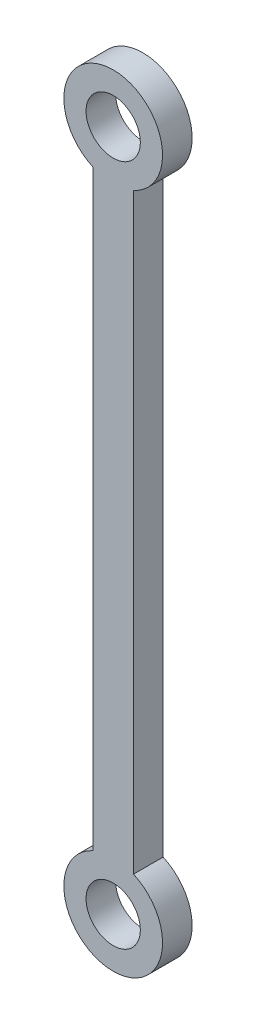
ISO-10303-21;
HEADER;
FILE_DESCRIPTION(('STEP AP214'),'2;1');
FILE_NAME('part.step','',(''),(''),'','','');
FILE_SCHEMA(('AUTOMOTIVE_DESIGN { 1 0 10303 214 1 1 1 1 }'));
ENDSEC;
DATA;
#1=APPLICATION_CONTEXT('core data for automotive mechanical design processes');
#2=APPLICATION_PROTOCOL_DEFINITION('international standard','automotive_design',2000,#1);
#3=PRODUCT_CONTEXT('',#1,'mechanical');
#4=PRODUCT('Part','Part','',(#3));
#5=PRODUCT_RELATED_PRODUCT_CATEGORY('part','',(#4));
#6=PRODUCT_DEFINITION_FORMATION('','',#4);
#7=PRODUCT_DEFINITION_CONTEXT('part definition',#1,'design');
#8=PRODUCT_DEFINITION('design','',#6,#7);
#9=PRODUCT_DEFINITION_SHAPE('','',#8);
#10=(LENGTH_UNIT() NAMED_UNIT(*) SI_UNIT(.MILLI.,.METRE.));
#11=(NAMED_UNIT(*) PLANE_ANGLE_UNIT() SI_UNIT($,.RADIAN.));
#12=(NAMED_UNIT(*) SI_UNIT($,.STERADIAN.) SOLID_ANGLE_UNIT());
#13=UNCERTAINTY_MEASURE_WITH_UNIT(LENGTH_MEASURE(1.E-05),#10,'distance_accuracy_value','');
#14=(GEOMETRIC_REPRESENTATION_CONTEXT(3) GLOBAL_UNCERTAINTY_ASSIGNED_CONTEXT((#13)) GLOBAL_UNIT_ASSIGNED_CONTEXT((#10,
#11,#12)) REPRESENTATION_CONTEXT('',''));
#15=CARTESIAN_POINT('',(0.,0.,0.));
#16=DIRECTION('',(0.,0.,1.));
#17=DIRECTION('',(1.,0.,0.));
#18=AXIS2_PLACEMENT_3D('',#15,#16,#17);
#19=CARTESIAN_POINT('',(642.687607750701,-1296.13673865925,1.5));
#20=DIRECTION('',(0.,0.,1.));
#21=DIRECTION('',(1.,0.,0.));
#22=AXIS2_PLACEMENT_3D('',#19,#20,#21);
#23=PLANE('',#22);
#24=CARTESIAN_POINT('',(642.687607750701,-1296.13673865925,1.5));
#25=DIRECTION('',(0.,0.,1.));
#26=DIRECTION('',(1.,0.,0.));
#27=AXIS2_PLACEMENT_3D('',#24,#25,#26);
#28=CIRCLE('',#27,2.75000000000002);
#29=CARTESIAN_POINT('',(645.437607750701,-1296.13673865925,1.5));
#30=VERTEX_POINT('',#29);
#31=EDGE_CURVE('E107',#30,#30,#28,.T.);
#32=ORIENTED_EDGE('',*,*,#31,.F.);
#33=EDGE_LOOP('',(#32));
#34=FACE_BOUND('',#33,.T.);
#35=CARTESIAN_POINT('',(642.687607750701,-1296.13673865925,1.5));
#36=DIRECTION('',(0.,0.,1.));
#37=DIRECTION('',(1.,0.,0.));
#38=AXIS2_PLACEMENT_3D('',#35,#36,#37);
#39=CIRCLE('',#38,5.00000000000005);
#40=CARTESIAN_POINT('',(640.625334238876,-1291.58184810486,1.5));
#41=VERTEX_POINT('',#40);
#42=CARTESIAN_POINT('',(644.749881262525,-1291.58184810486,1.5));
#43=VERTEX_POINT('',#42);
#44=EDGE_CURVE('E92',#41,#43,#39,.T.);
#45=ORIENTED_EDGE('',*,*,#44,.T.);
#46=DIRECTION('',(0.,1.,0.));
#47=VECTOR('',#46,1.);
#48=CARTESIAN_POINT('',(644.749881262525,-1231.58184810486,1.5));
#49=LINE('',#48,#47);
#50=CARTESIAN_POINT('',(644.749881262525,-1231.58184810486,1.5));
#51=VERTEX_POINT('',#50);
#52=EDGE_CURVE('E87',#43,#51,#49,.T.);
#53=ORIENTED_EDGE('',*,*,#52,.T.);
#54=CARTESIAN_POINT('',(642.687607750701,-1227.02695755047,1.5));
#55=DIRECTION('',(0.,0.,1.));
#56=DIRECTION('',(1.,0.,0.));
#57=AXIS2_PLACEMENT_3D('',#54,#55,#56);
#58=CIRCLE('',#57,5.00000000000018);
#59=CARTESIAN_POINT('',(640.625334238876,-1231.58184810486,1.5));
#60=VERTEX_POINT('',#59);
#61=EDGE_CURVE('E90',#51,#60,#58,.T.);
#62=ORIENTED_EDGE('',*,*,#61,.T.);
#63=DIRECTION('',(0.,-1.,0.));
#64=VECTOR('',#63,1.);
#65=CARTESIAN_POINT('',(640.625334238876,-1231.58184810486,1.5));
#66=LINE('',#65,#64);
#67=EDGE_CURVE('E57',#60,#41,#66,.T.);
#68=ORIENTED_EDGE('',*,*,#67,.T.);
#69=EDGE_LOOP('',(#45,#53,#62,#68));
#70=FACE_BOUND('',#69,.T.);
#71=CARTESIAN_POINT('',(642.687607750701,-1227.02695755047,1.5));
#72=DIRECTION('',(0.,0.,1.));
#73=DIRECTION('',(1.,0.,0.));
#74=AXIS2_PLACEMENT_3D('',#71,#72,#73);
#75=CIRCLE('',#74,2.75000000000002);
#76=CARTESIAN_POINT('',(645.437607750701,-1227.02695755047,1.5));
#77=VERTEX_POINT('',#76);
#78=EDGE_CURVE('E122',#77,#77,#75,.T.);
#79=ORIENTED_EDGE('',*,*,#78,.F.);
#80=EDGE_LOOP('',(#79));
#81=FACE_BOUND('',#80,.T.);
#82=ADVANCED_FACE('F40',(#34,#70,#81),#23,.T.);
#83=CARTESIAN_POINT('',(642.687607750701,-1296.13673865925,-1.5));
#84=DIRECTION('',(0.,0.,1.));
#85=DIRECTION('',(1.,0.,0.));
#86=AXIS2_PLACEMENT_3D('',#83,#84,#85);
#87=PLANE('',#86);
#88=CARTESIAN_POINT('',(642.687607750701,-1296.13673865925,-1.5));
#89=DIRECTION('',(0.,0.,1.));
#90=DIRECTION('',(1.,0.,0.));
#91=AXIS2_PLACEMENT_3D('',#88,#89,#90);
#92=CIRCLE('',#91,5.00000000000005);
#93=CARTESIAN_POINT('',(640.625334238876,-1291.58184810486,-1.5));
#94=VERTEX_POINT('',#93);
#95=CARTESIAN_POINT('',(644.749881262525,-1291.58184810486,-1.5));
#96=VERTEX_POINT('',#95);
#97=EDGE_CURVE('E104',#94,#96,#92,.T.);
#98=ORIENTED_EDGE('',*,*,#97,.F.);
#99=DIRECTION('',(0.,-1.,0.));
#100=VECTOR('',#99,1.);
#101=CARTESIAN_POINT('',(640.625334238876,-1231.58184810486,-1.5));
#102=LINE('',#101,#100);
#103=CARTESIAN_POINT('',(640.625334238876,-1231.58184810486,-1.5));
#104=VERTEX_POINT('',#103);
#105=EDGE_CURVE('E80',#104,#94,#102,.T.);
#106=ORIENTED_EDGE('',*,*,#105,.F.);
#107=CARTESIAN_POINT('',(642.687607750701,-1227.02695755047,-1.5));
#108=DIRECTION('',(0.,0.,1.));
#109=DIRECTION('',(1.,0.,0.));
#110=AXIS2_PLACEMENT_3D('',#107,#108,#109);
#111=CIRCLE('',#110,5.00000000000018);
#112=CARTESIAN_POINT('',(644.749881262525,-1231.58184810486,-1.5));
#113=VERTEX_POINT('',#112);
#114=EDGE_CURVE('E74',#113,#104,#111,.T.);
#115=ORIENTED_EDGE('',*,*,#114,.F.);
#116=DIRECTION('',(0.,1.,0.));
#117=VECTOR('',#116,1.);
#118=CARTESIAN_POINT('',(644.749881262525,-1231.58184810486,-1.5));
#119=LINE('',#118,#117);
#120=EDGE_CURVE('E96',#96,#113,#119,.T.);
#121=ORIENTED_EDGE('',*,*,#120,.F.);
#122=EDGE_LOOP('',(#98,#106,#115,#121));
#123=FACE_BOUND('',#122,.T.);
#124=CARTESIAN_POINT('',(642.687607750701,-1296.13673865925,-1.5));
#125=DIRECTION('',(0.,0.,1.));
#126=DIRECTION('',(1.,0.,0.));
#127=AXIS2_PLACEMENT_3D('',#124,#125,#126);
#128=CIRCLE('',#127,2.75000000000002);
#129=CARTESIAN_POINT('',(645.437607750701,-1296.13673865925,-1.5));
#130=VERTEX_POINT('',#129);
#131=EDGE_CURVE('E119',#130,#130,#128,.T.);
#132=ORIENTED_EDGE('',*,*,#131,.T.);
#133=EDGE_LOOP('',(#132));
#134=FACE_BOUND('',#133,.T.);
#135=CARTESIAN_POINT('',(642.687607750701,-1227.02695755047,-1.5));
#136=DIRECTION('',(0.,0.,1.));
#137=DIRECTION('',(1.,0.,0.));
#138=AXIS2_PLACEMENT_3D('',#135,#136,#137);
#139=CIRCLE('',#138,2.75000000000002);
#140=CARTESIAN_POINT('',(645.437607750701,-1227.02695755047,-1.5));
#141=VERTEX_POINT('',#140);
#142=EDGE_CURVE('E125',#141,#141,#139,.T.);
#143=ORIENTED_EDGE('',*,*,#142,.T.);
#144=EDGE_LOOP('',(#143));
#145=FACE_BOUND('',#144,.T.);
#146=ADVANCED_FACE('F115',(#123,#134,#145),#87,.F.);
#147=CARTESIAN_POINT('',(642.687607750701,-1296.13673865925,1.5));
#148=DIRECTION('',(0.,0.,-1.));
#149=DIRECTION('',(-1.,0.,0.));
#150=AXIS2_PLACEMENT_3D('',#147,#148,#149);
#151=CYLINDRICAL_SURFACE('',#150,5.00000000000005);
#152=ORIENTED_EDGE('',*,*,#97,.T.);
#153=DIRECTION('',(0.,0.,-1.));
#154=VECTOR('',#153,1.);
#155=CARTESIAN_POINT('',(644.749881262525,-1291.58184810486,1.5));
#156=LINE('',#155,#154);
#157=EDGE_CURVE('E11',#43,#96,#156,.T.);
#158=ORIENTED_EDGE('',*,*,#157,.F.);
#159=ORIENTED_EDGE('',*,*,#44,.F.);
#160=DIRECTION('',(0.,0.,-1.));
#161=VECTOR('',#160,1.);
#162=CARTESIAN_POINT('',(640.625334238876,-1291.58184810486,1.5));
#163=LINE('',#162,#161);
#164=EDGE_CURVE('E100',#41,#94,#163,.T.);
#165=ORIENTED_EDGE('',*,*,#164,.T.);
#166=EDGE_LOOP('',(#152,#158,#159,#165));
#167=FACE_BOUND('',#166,.T.);
#168=ADVANCED_FACE('F42',(#167),#151,.T.);
#169=CARTESIAN_POINT('',(644.749881262525,-1231.58184810486,1.5));
#170=DIRECTION('',(-1.,0.,0.));
#171=DIRECTION('',(0.,0.,1.));
#172=AXIS2_PLACEMENT_3D('',#169,#170,#171);
#173=PLANE('',#172);
#174=ORIENTED_EDGE('',*,*,#120,.T.);
#175=DIRECTION('',(0.,0.,-1.));
#176=VECTOR('',#175,1.);
#177=CARTESIAN_POINT('',(644.749881262525,-1231.58184810486,1.5));
#178=LINE('',#177,#176);
#179=EDGE_CURVE('E49',#51,#113,#178,.T.);
#180=ORIENTED_EDGE('',*,*,#179,.F.);
#181=ORIENTED_EDGE('',*,*,#52,.F.);
#182=ORIENTED_EDGE('',*,*,#157,.T.);
#183=EDGE_LOOP('',(#174,#180,#181,#182));
#184=FACE_BOUND('',#183,.T.);
#185=ADVANCED_FACE('F95',(#184),#173,.F.);
#186=CARTESIAN_POINT('',(642.687607750701,-1227.02695755047,1.5));
#187=DIRECTION('',(0.,0.,-1.));
#188=DIRECTION('',(-1.,0.,0.));
#189=AXIS2_PLACEMENT_3D('',#186,#187,#188);
#190=CYLINDRICAL_SURFACE('',#189,5.00000000000018);
#191=ORIENTED_EDGE('',*,*,#114,.T.);
#192=DIRECTION('',(0.,0.,-1.));
#193=VECTOR('',#192,1.);
#194=CARTESIAN_POINT('',(640.625334238876,-1231.58184810486,1.5));
#195=LINE('',#194,#193);
#196=EDGE_CURVE('E97',#60,#104,#195,.T.);
#197=ORIENTED_EDGE('',*,*,#196,.F.);
#198=ORIENTED_EDGE('',*,*,#61,.F.);
#199=ORIENTED_EDGE('',*,*,#179,.T.);
#200=EDGE_LOOP('',(#191,#197,#198,#199));
#201=FACE_BOUND('',#200,.T.);
#202=ADVANCED_FACE('F98',(#201),#190,.T.);
#203=CARTESIAN_POINT('',(640.625334238876,-1231.58184810486,1.5));
#204=DIRECTION('',(1.,0.,0.));
#205=DIRECTION('',(0.,1.,0.));
#206=AXIS2_PLACEMENT_3D('',#203,#204,#205);
#207=PLANE('',#206);
#208=ORIENTED_EDGE('',*,*,#105,.T.);
#209=ORIENTED_EDGE('',*,*,#164,.F.);
#210=ORIENTED_EDGE('',*,*,#67,.F.);
#211=ORIENTED_EDGE('',*,*,#196,.T.);
#212=EDGE_LOOP('',(#208,#209,#210,#211));
#213=FACE_BOUND('',#212,.T.);
#214=ADVANCED_FACE('F112',(#213),#207,.F.);
#215=CARTESIAN_POINT('',(642.687607750701,-1296.13673865925,1.5));
#216=DIRECTION('',(0.,0.,-1.));
#217=DIRECTION('',(-1.,0.,0.));
#218=AXIS2_PLACEMENT_3D('',#215,#216,#217);
#219=CYLINDRICAL_SURFACE('',#218,2.75000000000002);
#220=ORIENTED_EDGE('',*,*,#31,.T.);
#221=EDGE_LOOP('',(#220));
#222=FACE_BOUND('',#221,.T.);
#223=ORIENTED_EDGE('',*,*,#131,.F.);
#224=EDGE_LOOP('',(#223));
#225=FACE_BOUND('',#224,.T.);
#226=ADVANCED_FACE('F142',(#222,#225),#219,.F.);
#227=CARTESIAN_POINT('',(642.687607750701,-1227.02695755047,1.5));
#228=DIRECTION('',(0.,0.,-1.));
#229=DIRECTION('',(-1.,0.,0.));
#230=AXIS2_PLACEMENT_3D('',#227,#228,#229);
#231=CYLINDRICAL_SURFACE('',#230,2.75000000000002);
#232=ORIENTED_EDGE('',*,*,#78,.T.);
#233=EDGE_LOOP('',(#232));
#234=FACE_BOUND('',#233,.T.);
#235=ORIENTED_EDGE('',*,*,#142,.F.);
#236=EDGE_LOOP('',(#235));
#237=FACE_BOUND('',#236,.T.);
#238=ADVANCED_FACE('F131',(#234,#237),#231,.F.);
#239=CLOSED_SHELL('',(#82,#146,#168,#185,#202,#214,#226,#238));
#240=MANIFOLD_SOLID_BREP('B2',#239);
#241=ADVANCED_BREP_SHAPE_REPRESENTATION('',(#18,#240),#14);
#242=SHAPE_DEFINITION_REPRESENTATION(#9,#241);
ENDSEC;
END-ISO-10303-21;
